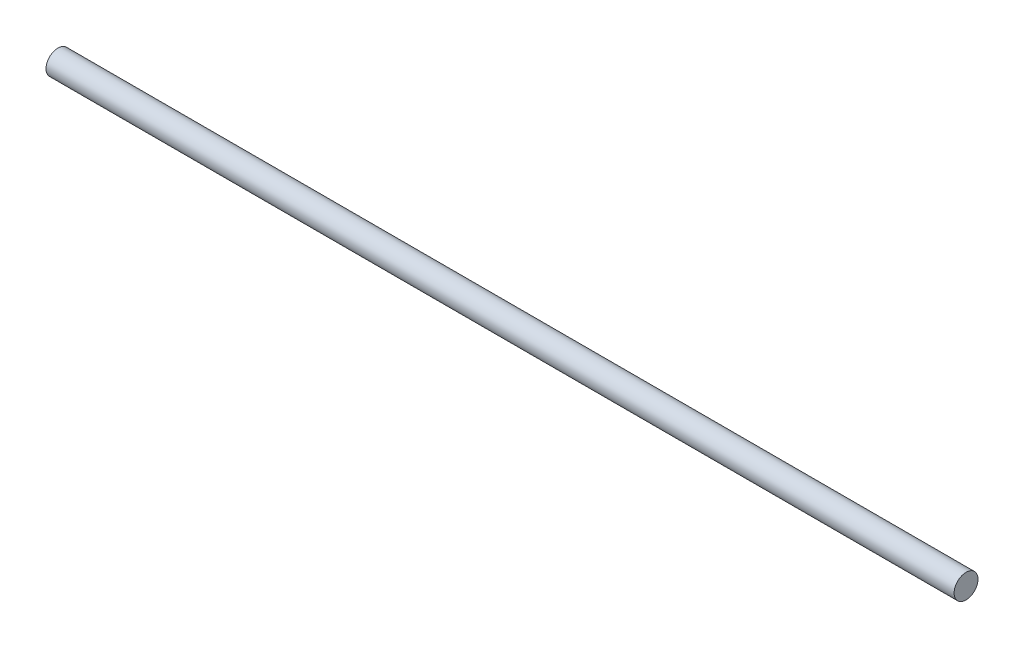
ISO-10303-21;
HEADER;
FILE_DESCRIPTION(('STEP AP214'),'2;1');
FILE_NAME('part.step','',(''),(''),'','','');
FILE_SCHEMA(('AUTOMOTIVE_DESIGN { 1 0 10303 214 1 1 1 1 }'));
ENDSEC;
DATA;
#1=APPLICATION_CONTEXT('core data for automotive mechanical design processes');
#2=APPLICATION_PROTOCOL_DEFINITION('international standard','automotive_design',2000,#1);
#3=PRODUCT_CONTEXT('',#1,'mechanical');
#4=PRODUCT('Part','Part','',(#3));
#5=PRODUCT_RELATED_PRODUCT_CATEGORY('part','',(#4));
#6=PRODUCT_DEFINITION_FORMATION('','',#4);
#7=PRODUCT_DEFINITION_CONTEXT('part definition',#1,'design');
#8=PRODUCT_DEFINITION('design','',#6,#7);
#9=PRODUCT_DEFINITION_SHAPE('','',#8);
#10=(LENGTH_UNIT() NAMED_UNIT(*) SI_UNIT(.MILLI.,.METRE.));
#11=(NAMED_UNIT(*) PLANE_ANGLE_UNIT() SI_UNIT($,.RADIAN.));
#12=(NAMED_UNIT(*) SI_UNIT($,.STERADIAN.) SOLID_ANGLE_UNIT());
#13=UNCERTAINTY_MEASURE_WITH_UNIT(LENGTH_MEASURE(1.E-05),#10,'distance_accuracy_value','');
#14=(GEOMETRIC_REPRESENTATION_CONTEXT(3) GLOBAL_UNCERTAINTY_ASSIGNED_CONTEXT((#13)) GLOBAL_UNIT_ASSIGNED_CONTEXT((#10,
#11,#12)) REPRESENTATION_CONTEXT('',''));
#15=CARTESIAN_POINT('',(0.,0.,0.));
#16=DIRECTION('',(0.,0.,1.));
#17=DIRECTION('',(1.,0.,0.));
#18=AXIS2_PLACEMENT_3D('',#15,#16,#17);
#19=CARTESIAN_POINT('',(-89.559902200489,15.1371638141809,0.));
#20=DIRECTION('',(-1.,0.,0.));
#21=DIRECTION('',(0.,0.,1.));
#22=AXIS2_PLACEMENT_3D('',#19,#20,#21);
#23=PLANE('',#22);
#24=CARTESIAN_POINT('',(-89.559902200489,15.1371638141809,0.));
#25=DIRECTION('',(-1.,0.,0.));
#26=DIRECTION('',(0.,0.,1.));
#27=AXIS2_PLACEMENT_3D('',#24,#25,#26);
#28=CIRCLE('',#27,2.9);
#29=CARTESIAN_POINT('',(-89.559902200489,15.1371638141809,2.9));
#30=VERTEX_POINT('',#29);
#31=EDGE_CURVE('E10',#30,#30,#28,.T.);
#32=ORIENTED_EDGE('',*,*,#31,.T.);
#33=EDGE_LOOP('',(#32));
#34=FACE_BOUND('',#33,.T.);
#35=ADVANCED_FACE('F35',(#34),#23,.T.);
#36=CARTESIAN_POINT('',(-89.559902200489,15.1371638141809,0.));
#37=DIRECTION('',(-1.,0.,0.));
#38=DIRECTION('',(0.,0.,1.));
#39=AXIS2_PLACEMENT_3D('',#36,#37,#38);
#40=CYLINDRICAL_SURFACE('',#39,2.9);
#41=CARTESIAN_POINT('',(130.440097799511,15.1371638141809,0.));
#42=DIRECTION('',(-1.,0.,0.));
#43=DIRECTION('',(0.,0.,1.));
#44=AXIS2_PLACEMENT_3D('',#41,#42,#43);
#45=CIRCLE('',#44,2.9);
#46=CARTESIAN_POINT('',(130.440097799511,15.1371638141809,2.9));
#47=VERTEX_POINT('',#46);
#48=EDGE_CURVE('E41',#47,#47,#45,.T.);
#49=ORIENTED_EDGE('',*,*,#48,.T.);
#50=EDGE_LOOP('',(#49));
#51=FACE_BOUND('',#50,.T.);
#52=ORIENTED_EDGE('',*,*,#31,.F.);
#53=EDGE_LOOP('',(#52));
#54=FACE_BOUND('',#53,.T.);
#55=ADVANCED_FACE('F47',(#51,#54),#40,.T.);
#56=CARTESIAN_POINT('',(130.440097799511,15.1371638141809,0.));
#57=DIRECTION('',(1.,0.,0.));
#58=DIRECTION('',(0.,0.,-1.));
#59=AXIS2_PLACEMENT_3D('',#56,#57,#58);
#60=PLANE('',#59);
#61=ORIENTED_EDGE('',*,*,#48,.F.);
#62=EDGE_LOOP('',(#61));
#63=FACE_BOUND('',#62,.T.);
#64=ADVANCED_FACE('F50',(#63),#60,.T.);
#65=CLOSED_SHELL('',(#35,#55,#64));
#66=MANIFOLD_SOLID_BREP('B2',#65);
#67=ADVANCED_BREP_SHAPE_REPRESENTATION('',(#18,#66),#14);
#68=SHAPE_DEFINITION_REPRESENTATION(#9,#67);
ENDSEC;
END-ISO-10303-21;
